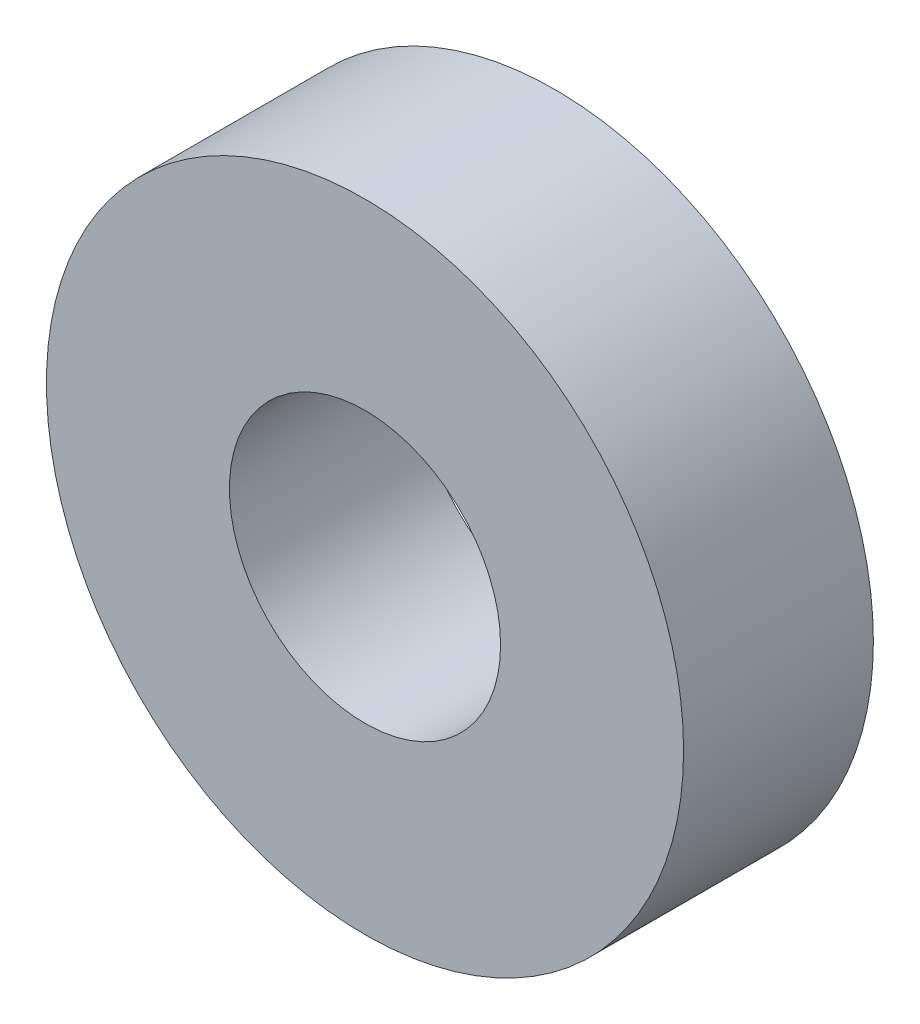
ISO-10303-21;
HEADER;
FILE_DESCRIPTION(('STEP AP214'),'2;1');
FILE_NAME('part.step','',(''),(''),'','','');
FILE_SCHEMA(('AUTOMOTIVE_DESIGN { 1 0 10303 214 1 1 1 1 }'));
ENDSEC;
DATA;
#1=APPLICATION_CONTEXT('core data for automotive mechanical design processes');
#2=APPLICATION_PROTOCOL_DEFINITION('international standard','automotive_design',2000,#1);
#3=PRODUCT_CONTEXT('',#1,'mechanical');
#4=PRODUCT('Part','Part','',(#3));
#5=PRODUCT_RELATED_PRODUCT_CATEGORY('part','',(#4));
#6=PRODUCT_DEFINITION_FORMATION('','',#4);
#7=PRODUCT_DEFINITION_CONTEXT('part definition',#1,'design');
#8=PRODUCT_DEFINITION('design','',#6,#7);
#9=PRODUCT_DEFINITION_SHAPE('','',#8);
#10=(LENGTH_UNIT() NAMED_UNIT(*) SI_UNIT(.MILLI.,.METRE.));
#11=(NAMED_UNIT(*) PLANE_ANGLE_UNIT() SI_UNIT($,.RADIAN.));
#12=(NAMED_UNIT(*) SI_UNIT($,.STERADIAN.) SOLID_ANGLE_UNIT());
#13=UNCERTAINTY_MEASURE_WITH_UNIT(LENGTH_MEASURE(1.E-05),#10,'distance_accuracy_value','');
#14=(GEOMETRIC_REPRESENTATION_CONTEXT(3) GLOBAL_UNCERTAINTY_ASSIGNED_CONTEXT((#13)) GLOBAL_UNIT_ASSIGNED_CONTEXT((#10,
#11,#12)) REPRESENTATION_CONTEXT('',''));
#15=CARTESIAN_POINT('',(0.,0.,0.));
#16=DIRECTION('',(0.,0.,1.));
#17=DIRECTION('',(1.,0.,0.));
#18=AXIS2_PLACEMENT_3D('',#15,#16,#17);
#19=CARTESIAN_POINT('',(0.,0.,40.));
#20=DIRECTION('',(0.,0.,1.));
#21=DIRECTION('',(1.,0.,0.));
#22=AXIS2_PLACEMENT_3D('',#19,#20,#21);
#23=PLANE('',#22);
#24=CARTESIAN_POINT('',(0.,0.,40.));
#25=DIRECTION('',(0.,0.,1.));
#26=DIRECTION('',(1.,0.,0.));
#27=AXIS2_PLACEMENT_3D('',#24,#25,#26);
#28=CIRCLE('',#27,23.5);
#29=CARTESIAN_POINT('',(23.5,0.,40.));
#30=VERTEX_POINT('',#29);
#31=EDGE_CURVE('E10',#30,#30,#28,.T.);
#32=ORIENTED_EDGE('',*,*,#31,.T.);
#33=EDGE_LOOP('',(#32));
#34=FACE_BOUND('',#33,.T.);
#35=CARTESIAN_POINT('',(0.,0.,40.));
#36=DIRECTION('',(0.,0.,1.));
#37=DIRECTION('',(1.,0.,0.));
#38=AXIS2_PLACEMENT_3D('',#35,#36,#37);
#39=CIRCLE('',#38,10.);
#40=CARTESIAN_POINT('',(10.,0.,40.));
#41=VERTEX_POINT('',#40);
#42=EDGE_CURVE('E46',#41,#41,#39,.T.);
#43=ORIENTED_EDGE('',*,*,#42,.F.);
#44=EDGE_LOOP('',(#43));
#45=FACE_BOUND('',#44,.T.);
#46=ADVANCED_FACE('F35',(#34,#45),#23,.T.);
#47=CARTESIAN_POINT('',(0.,0.,26.));
#48=DIRECTION('',(0.,0.,1.));
#49=DIRECTION('',(1.,0.,0.));
#50=AXIS2_PLACEMENT_3D('',#47,#48,#49);
#51=PLANE('',#50);
#52=CARTESIAN_POINT('',(0.,0.,26.));
#53=DIRECTION('',(0.,0.,1.));
#54=DIRECTION('',(1.,0.,0.));
#55=AXIS2_PLACEMENT_3D('',#52,#53,#54);
#56=CIRCLE('',#55,23.5);
#57=CARTESIAN_POINT('',(23.5,0.,26.));
#58=VERTEX_POINT('',#57);
#59=EDGE_CURVE('E39',#58,#58,#56,.T.);
#60=ORIENTED_EDGE('',*,*,#59,.F.);
#61=EDGE_LOOP('',(#60));
#62=FACE_BOUND('',#61,.T.);
#63=CARTESIAN_POINT('',(0.,0.,26.));
#64=DIRECTION('',(0.,0.,1.));
#65=DIRECTION('',(1.,0.,0.));
#66=AXIS2_PLACEMENT_3D('',#63,#64,#65);
#67=CIRCLE('',#66,10.);
#68=CARTESIAN_POINT('',(10.,0.,26.));
#69=VERTEX_POINT('',#68);
#70=EDGE_CURVE('E48',#69,#69,#67,.T.);
#71=ORIENTED_EDGE('',*,*,#70,.T.);
#72=EDGE_LOOP('',(#71));
#73=FACE_BOUND('',#72,.T.);
#74=ADVANCED_FACE('F58',(#62,#73),#51,.F.);
#75=CARTESIAN_POINT('',(0.,0.,40.));
#76=DIRECTION('',(0.,0.,-1.));
#77=DIRECTION('',(-1.,0.,0.));
#78=AXIS2_PLACEMENT_3D('',#75,#76,#77);
#79=CYLINDRICAL_SURFACE('',#78,23.5);
#80=ORIENTED_EDGE('',*,*,#31,.F.);
#81=EDGE_LOOP('',(#80));
#82=FACE_BOUND('',#81,.T.);
#83=ORIENTED_EDGE('',*,*,#59,.T.);
#84=EDGE_LOOP('',(#83));
#85=FACE_BOUND('',#84,.T.);
#86=ADVANCED_FACE('F37',(#82,#85),#79,.T.);
#87=CARTESIAN_POINT('',(0.,0.,40.));
#88=DIRECTION('',(0.,0.,-1.));
#89=DIRECTION('',(-1.,0.,0.));
#90=AXIS2_PLACEMENT_3D('',#87,#88,#89);
#91=CYLINDRICAL_SURFACE('',#90,10.);
#92=ORIENTED_EDGE('',*,*,#42,.T.);
#93=EDGE_LOOP('',(#92));
#94=FACE_BOUND('',#93,.T.);
#95=ORIENTED_EDGE('',*,*,#70,.F.);
#96=EDGE_LOOP('',(#95));
#97=FACE_BOUND('',#96,.T.);
#98=ADVANCED_FACE('F54',(#94,#97),#91,.F.);
#99=CLOSED_SHELL('',(#46,#74,#86,#98));
#100=MANIFOLD_SOLID_BREP('B2',#99);
#101=ADVANCED_BREP_SHAPE_REPRESENTATION('',(#18,#100),#14);
#102=SHAPE_DEFINITION_REPRESENTATION(#9,#101);
ENDSEC;
END-ISO-10303-21;
